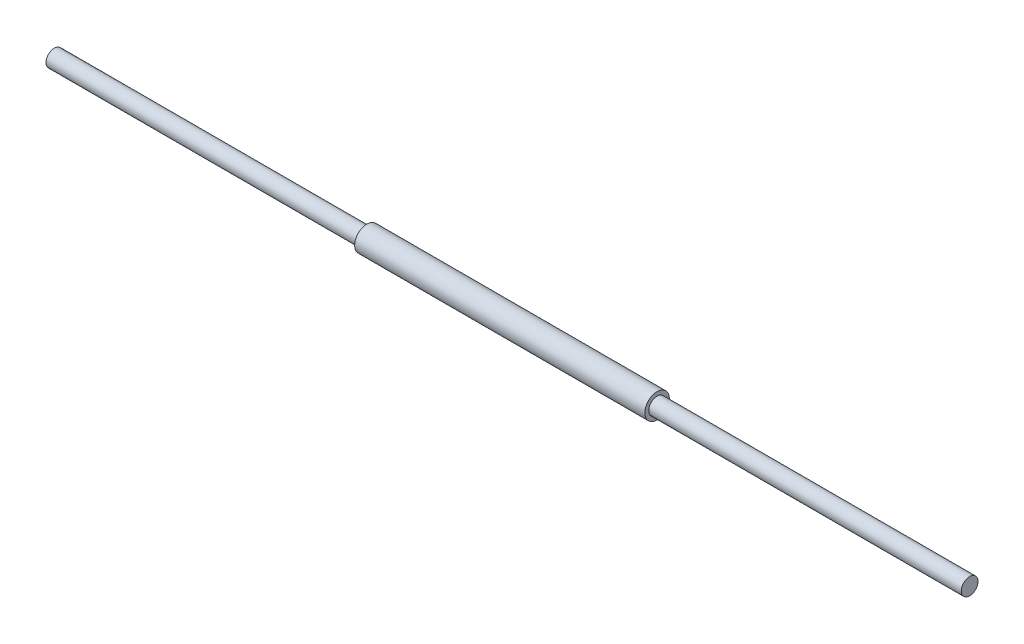
ISO-10303-21;
HEADER;
FILE_DESCRIPTION(('STEP AP214'),'2;1');
FILE_NAME('part.step','',(''),(''),'','','');
FILE_SCHEMA(('AUTOMOTIVE_DESIGN { 1 0 10303 214 1 1 1 1 }'));
ENDSEC;
DATA;
#1=APPLICATION_CONTEXT('core data for automotive mechanical design processes');
#2=APPLICATION_PROTOCOL_DEFINITION('international standard','automotive_design',2000,#1);
#3=PRODUCT_CONTEXT('',#1,'mechanical');
#4=PRODUCT('Part','Part','',(#3));
#5=PRODUCT_RELATED_PRODUCT_CATEGORY('part','',(#4));
#6=PRODUCT_DEFINITION_FORMATION('','',#4);
#7=PRODUCT_DEFINITION_CONTEXT('part definition',#1,'design');
#8=PRODUCT_DEFINITION('design','',#6,#7);
#9=PRODUCT_DEFINITION_SHAPE('','',#8);
#10=(LENGTH_UNIT() NAMED_UNIT(*) SI_UNIT(.MILLI.,.METRE.));
#11=(NAMED_UNIT(*) PLANE_ANGLE_UNIT() SI_UNIT($,.RADIAN.));
#12=(NAMED_UNIT(*) SI_UNIT($,.STERADIAN.) SOLID_ANGLE_UNIT());
#13=UNCERTAINTY_MEASURE_WITH_UNIT(LENGTH_MEASURE(1.E-05),#10,'distance_accuracy_value','');
#14=(GEOMETRIC_REPRESENTATION_CONTEXT(3) GLOBAL_UNCERTAINTY_ASSIGNED_CONTEXT((#13)) GLOBAL_UNIT_ASSIGNED_CONTEXT((#10,
#11,#12)) REPRESENTATION_CONTEXT('',''));
#15=CARTESIAN_POINT('',(0.,0.,0.));
#16=DIRECTION('',(0.,0.,1.));
#17=DIRECTION('',(1.,0.,0.));
#18=AXIS2_PLACEMENT_3D('',#15,#16,#17);
#19=CARTESIAN_POINT('',(520.7,0.,0.));
#20=DIRECTION('',(-1.,0.,0.));
#21=DIRECTION('',(0.,0.,1.));
#22=AXIS2_PLACEMENT_3D('',#19,#20,#21);
#23=PLANE('',#22);
#24=CARTESIAN_POINT('',(520.7,0.,0.));
#25=DIRECTION('',(-1.,0.,0.));
#26=DIRECTION('',(0.,0.,1.));
#27=AXIS2_PLACEMENT_3D('',#24,#25,#26);
#28=CIRCLE('',#27,4.7625);
#29=CARTESIAN_POINT('',(520.7,0.,4.7625));
#30=VERTEX_POINT('',#29);
#31=EDGE_CURVE('E10',#30,#30,#28,.T.);
#32=ORIENTED_EDGE('',*,*,#31,.F.);
#33=EDGE_LOOP('',(#32));
#34=FACE_BOUND('',#33,.T.);
#35=ADVANCED_FACE('F45',(#34),#23,.F.);
#36=CARTESIAN_POINT('',(342.9,0.,0.));
#37=DIRECTION('',(-1.,0.,0.));
#38=DIRECTION('',(0.,0.,1.));
#39=AXIS2_PLACEMENT_3D('',#36,#37,#38);
#40=CYLINDRICAL_SURFACE('',#39,4.7625);
#41=ORIENTED_EDGE('',*,*,#31,.T.);
#42=EDGE_LOOP('',(#41));
#43=FACE_BOUND('',#42,.T.);
#44=CARTESIAN_POINT('',(342.9,0.,0.));
#45=DIRECTION('',(-1.,0.,0.));
#46=DIRECTION('',(0.,0.,1.));
#47=AXIS2_PLACEMENT_3D('',#44,#45,#46);
#48=CIRCLE('',#47,4.7625);
#49=CARTESIAN_POINT('',(342.9,0.,4.7625));
#50=VERTEX_POINT('',#49);
#51=EDGE_CURVE('E52',#50,#50,#48,.T.);
#52=ORIENTED_EDGE('',*,*,#51,.F.);
#53=EDGE_LOOP('',(#52));
#54=FACE_BOUND('',#53,.T.);
#55=ADVANCED_FACE('F93',(#43,#54),#40,.T.);
#56=CARTESIAN_POINT('',(342.9,0.,0.));
#57=DIRECTION('',(-1.,0.,0.));
#58=DIRECTION('',(0.,0.,1.));
#59=AXIS2_PLACEMENT_3D('',#56,#57,#58);
#60=PLANE('',#59);
#61=CARTESIAN_POINT('',(342.9,0.,0.));
#62=DIRECTION('',(-1.,0.,0.));
#63=DIRECTION('',(0.,0.,1.));
#64=AXIS2_PLACEMENT_3D('',#61,#62,#63);
#65=CIRCLE('',#64,6.985);
#66=CARTESIAN_POINT('',(342.9,0.,6.985));
#67=VERTEX_POINT('',#66);
#68=EDGE_CURVE('E57',#67,#67,#65,.T.);
#69=ORIENTED_EDGE('',*,*,#68,.F.);
#70=EDGE_LOOP('',(#69));
#71=FACE_BOUND('',#70,.T.);
#72=ORIENTED_EDGE('',*,*,#51,.T.);
#73=EDGE_LOOP('',(#72));
#74=FACE_BOUND('',#73,.T.);
#75=ADVANCED_FACE('F98',(#71,#74),#60,.F.);
#76=CARTESIAN_POINT('',(342.9,0.,0.));
#77=DIRECTION('',(-1.,0.,0.));
#78=DIRECTION('',(0.,0.,1.));
#79=AXIS2_PLACEMENT_3D('',#76,#77,#78);
#80=CYLINDRICAL_SURFACE('',#79,6.985);
#81=ORIENTED_EDGE('',*,*,#68,.T.);
#82=EDGE_LOOP('',(#81));
#83=FACE_BOUND('',#82,.T.);
#84=CARTESIAN_POINT('',(177.8,0.,0.));
#85=DIRECTION('',(-1.,0.,0.));
#86=DIRECTION('',(0.,0.,1.));
#87=AXIS2_PLACEMENT_3D('',#84,#85,#86);
#88=CIRCLE('',#87,6.985);
#89=CARTESIAN_POINT('',(177.8,0.,6.985));
#90=VERTEX_POINT('',#89);
#91=EDGE_CURVE('E62',#90,#90,#88,.T.);
#92=ORIENTED_EDGE('',*,*,#91,.F.);
#93=EDGE_LOOP('',(#92));
#94=FACE_BOUND('',#93,.T.);
#95=ADVANCED_FACE('F89',(#83,#94),#80,.T.);
#96=CARTESIAN_POINT('',(177.8,0.,0.));
#97=DIRECTION('',(-1.,0.,0.));
#98=DIRECTION('',(0.,0.,1.));
#99=AXIS2_PLACEMENT_3D('',#96,#97,#98);
#100=PLANE('',#99);
#101=ORIENTED_EDGE('',*,*,#91,.T.);
#102=EDGE_LOOP('',(#101));
#103=FACE_BOUND('',#102,.T.);
#104=CARTESIAN_POINT('',(177.8,0.,0.));
#105=DIRECTION('',(-1.,0.,0.));
#106=DIRECTION('',(0.,0.,1.));
#107=AXIS2_PLACEMENT_3D('',#104,#105,#106);
#108=CIRCLE('',#107,4.7625);
#109=CARTESIAN_POINT('',(177.8,0.,4.7625));
#110=VERTEX_POINT('',#109);
#111=EDGE_CURVE('E68',#110,#110,#108,.T.);
#112=ORIENTED_EDGE('',*,*,#111,.F.);
#113=EDGE_LOOP('',(#112));
#114=FACE_BOUND('',#113,.T.);
#115=ADVANCED_FACE('F81',(#103,#114),#100,.T.);
#116=CARTESIAN_POINT('',(342.9,0.,0.));
#117=DIRECTION('',(-1.,0.,0.));
#118=DIRECTION('',(0.,0.,1.));
#119=AXIS2_PLACEMENT_3D('',#116,#117,#118);
#120=CYLINDRICAL_SURFACE('',#119,4.7625);
#121=ORIENTED_EDGE('',*,*,#111,.T.);
#122=EDGE_LOOP('',(#121));
#123=FACE_BOUND('',#122,.T.);
#124=CARTESIAN_POINT('',(0.,0.,0.));
#125=DIRECTION('',(-1.,0.,0.));
#126=DIRECTION('',(0.,0.,1.));
#127=AXIS2_PLACEMENT_3D('',#124,#125,#126);
#128=CIRCLE('',#127,4.7625);
#129=CARTESIAN_POINT('',(0.,0.,4.7625));
#130=VERTEX_POINT('',#129);
#131=EDGE_CURVE('E72',#130,#130,#128,.T.);
#132=ORIENTED_EDGE('',*,*,#131,.F.);
#133=EDGE_LOOP('',(#132));
#134=FACE_BOUND('',#133,.T.);
#135=ADVANCED_FACE('F79',(#123,#134),#120,.T.);
#136=CARTESIAN_POINT('',(0.,0.,0.));
#137=DIRECTION('',(-1.,0.,0.));
#138=DIRECTION('',(0.,0.,1.));
#139=AXIS2_PLACEMENT_3D('',#136,#137,#138);
#140=PLANE('',#139);
#141=ORIENTED_EDGE('',*,*,#131,.T.);
#142=EDGE_LOOP('',(#141));
#143=FACE_BOUND('',#142,.T.);
#144=ADVANCED_FACE('F77',(#143),#140,.T.);
#145=CLOSED_SHELL('',(#35,#55,#75,#95,#115,#135,#144));
#146=MANIFOLD_SOLID_BREP('B2',#145);
#147=ADVANCED_BREP_SHAPE_REPRESENTATION('',(#18,#146),#14);
#148=SHAPE_DEFINITION_REPRESENTATION(#9,#147);
ENDSEC;
END-ISO-10303-21;
